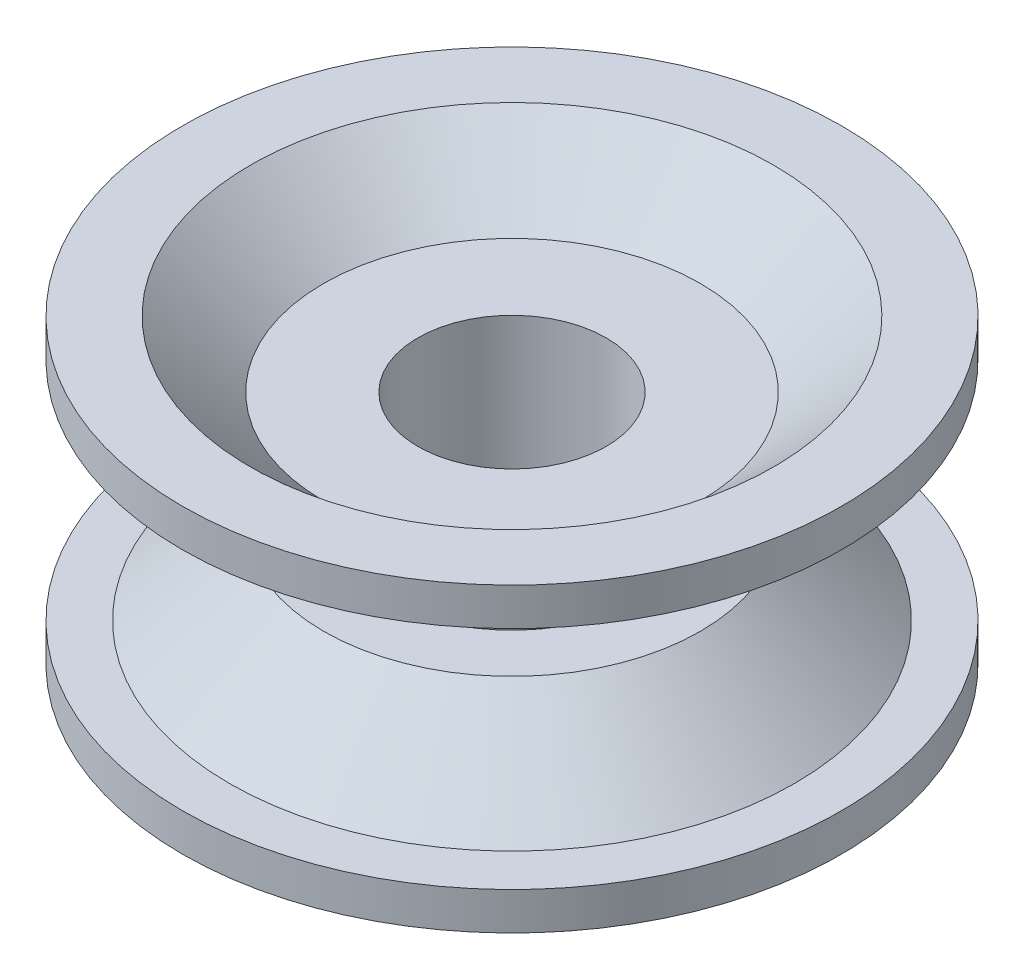
ISO-10303-21;
HEADER;
FILE_DESCRIPTION(('STEP AP214'),'2;1');
FILE_NAME('part.step','',(''),(''),'','','');
FILE_SCHEMA(('AUTOMOTIVE_DESIGN { 1 0 10303 214 1 1 1 1 }'));
ENDSEC;
DATA;
#1=APPLICATION_CONTEXT('core data for automotive mechanical design processes');
#2=APPLICATION_PROTOCOL_DEFINITION('international standard','automotive_design',2000,#1);
#3=PRODUCT_CONTEXT('',#1,'mechanical');
#4=PRODUCT('Part','Part','',(#3));
#5=PRODUCT_RELATED_PRODUCT_CATEGORY('part','',(#4));
#6=PRODUCT_DEFINITION_FORMATION('','',#4);
#7=PRODUCT_DEFINITION_CONTEXT('part definition',#1,'design');
#8=PRODUCT_DEFINITION('design','',#6,#7);
#9=PRODUCT_DEFINITION_SHAPE('','',#8);
#10=(LENGTH_UNIT() NAMED_UNIT(*) SI_UNIT(.MILLI.,.METRE.));
#11=(NAMED_UNIT(*) PLANE_ANGLE_UNIT() SI_UNIT($,.RADIAN.));
#12=(NAMED_UNIT(*) SI_UNIT($,.STERADIAN.) SOLID_ANGLE_UNIT());
#13=UNCERTAINTY_MEASURE_WITH_UNIT(LENGTH_MEASURE(1.E-05),#10,'distance_accuracy_value','');
#14=(GEOMETRIC_REPRESENTATION_CONTEXT(3) GLOBAL_UNCERTAINTY_ASSIGNED_CONTEXT((#13)) GLOBAL_UNIT_ASSIGNED_CONTEXT((#10,
#11,#12)) REPRESENTATION_CONTEXT('',''));
#15=CARTESIAN_POINT('',(0.,0.,0.));
#16=DIRECTION('',(0.,0.,1.));
#17=DIRECTION('',(1.,0.,0.));
#18=AXIS2_PLACEMENT_3D('',#15,#16,#17);
#19=CARTESIAN_POINT('',(0.,0.,0.));
#20=DIRECTION('',(0.,-1.,0.));
#21=DIRECTION('',(0.,0.,-1.));
#22=AXIS2_PLACEMENT_3D('',#19,#20,#21);
#23=CYLINDRICAL_SURFACE('',#22,3.5);
#24=CARTESIAN_POINT('',(0.,-1.2,0.));
#25=DIRECTION('',(0.,-1.,0.));
#26=DIRECTION('',(0.,0.,-1.));
#27=AXIS2_PLACEMENT_3D('',#24,#25,#26);
#28=CIRCLE('',#27,3.5);
#29=CARTESIAN_POINT('',(0.,-1.2,-3.5));
#30=VERTEX_POINT('',#29);
#31=EDGE_CURVE('E10',#30,#30,#28,.T.);
#32=ORIENTED_EDGE('',*,*,#31,.T.);
#33=EDGE_LOOP('',(#32));
#34=FACE_BOUND('',#33,.T.);
#35=CARTESIAN_POINT('',(0.,-1.6,0.));
#36=DIRECTION('',(0.,-1.,0.));
#37=DIRECTION('',(0.,0.,-1.));
#38=AXIS2_PLACEMENT_3D('',#35,#36,#37);
#39=CIRCLE('',#38,3.5);
#40=CARTESIAN_POINT('',(0.,-1.6,-3.5));
#41=VERTEX_POINT('',#40);
#42=EDGE_CURVE('E86',#41,#41,#39,.T.);
#43=ORIENTED_EDGE('',*,*,#42,.F.);
#44=EDGE_LOOP('',(#43));
#45=FACE_BOUND('',#44,.T.);
#46=ADVANCED_FACE('F28',(#34,#45),#23,.T.);
#47=CARTESIAN_POINT('',(3.5,-1.2,0.));
#48=DIRECTION('',(0.,1.,0.));
#49=DIRECTION('',(0.,0.,1.));
#50=AXIS2_PLACEMENT_3D('',#47,#48,#49);
#51=PLANE('',#50);
#52=CARTESIAN_POINT('',(0.,-1.2,0.));
#53=DIRECTION('',(0.,-1.,0.));
#54=DIRECTION('',(0.,0.,-1.));
#55=AXIS2_PLACEMENT_3D('',#52,#53,#54);
#56=CIRCLE('',#55,3.);
#57=CARTESIAN_POINT('',(0.,-1.2,-3.));
#58=VERTEX_POINT('',#57);
#59=EDGE_CURVE('E34',#58,#58,#56,.T.);
#60=ORIENTED_EDGE('',*,*,#59,.T.);
#61=EDGE_LOOP('',(#60));
#62=FACE_BOUND('',#61,.T.);
#63=ORIENTED_EDGE('',*,*,#31,.F.);
#64=EDGE_LOOP('',(#63));
#65=FACE_BOUND('',#64,.T.);
#66=ADVANCED_FACE('F94',(#62,#65),#51,.T.);
#67=CARTESIAN_POINT('',(0.,-1.2,0.));
#68=DIRECTION('',(0.,-1.,0.));
#69=DIRECTION('',(0.,0.,-1.));
#70=AXIS2_PLACEMENT_3D('',#67,#68,#69);
#71=CONICAL_SURFACE('',#70,3.,0.83798122500839);
#72=CARTESIAN_POINT('',(0.,-0.3,0.));
#73=DIRECTION('',(0.,-1.,0.));
#74=DIRECTION('',(0.,0.,-1.));
#75=AXIS2_PLACEMENT_3D('',#72,#73,#74);
#76=CIRCLE('',#75,2.);
#77=CARTESIAN_POINT('',(0.,-0.3,-2.));
#78=VERTEX_POINT('',#77);
#79=EDGE_CURVE('E38',#78,#78,#76,.T.);
#80=ORIENTED_EDGE('',*,*,#79,.T.);
#81=EDGE_LOOP('',(#80));
#82=FACE_BOUND('',#81,.T.);
#83=ORIENTED_EDGE('',*,*,#59,.F.);
#84=EDGE_LOOP('',(#83));
#85=FACE_BOUND('',#84,.T.);
#86=ADVANCED_FACE('F98',(#82,#85),#71,.T.);
#87=CARTESIAN_POINT('',(2.,-0.3,0.));
#88=DIRECTION('',(0.,1.,0.));
#89=DIRECTION('',(0.,0.,1.));
#90=AXIS2_PLACEMENT_3D('',#87,#88,#89);
#91=PLANE('',#90);
#92=CARTESIAN_POINT('',(0.,-0.3,0.));
#93=DIRECTION('',(0.,-1.,0.));
#94=DIRECTION('',(0.,0.,-1.));
#95=AXIS2_PLACEMENT_3D('',#92,#93,#94);
#96=CIRCLE('',#95,1.4);
#97=CARTESIAN_POINT('',(0.,-0.3,-1.4));
#98=VERTEX_POINT('',#97);
#99=EDGE_CURVE('E42',#98,#98,#96,.T.);
#100=ORIENTED_EDGE('',*,*,#99,.T.);
#101=EDGE_LOOP('',(#100));
#102=FACE_BOUND('',#101,.T.);
#103=ORIENTED_EDGE('',*,*,#79,.F.);
#104=EDGE_LOOP('',(#103));
#105=FACE_BOUND('',#104,.T.);
#106=ADVANCED_FACE('F102',(#102,#105),#91,.T.);
#107=CARTESIAN_POINT('',(0.,0.,0.));
#108=DIRECTION('',(0.,-1.,0.));
#109=DIRECTION('',(0.,0.,-1.));
#110=AXIS2_PLACEMENT_3D('',#107,#108,#109);
#111=CYLINDRICAL_SURFACE('',#110,1.4);
#112=CARTESIAN_POINT('',(0.,0.3,0.));
#113=DIRECTION('',(0.,-1.,0.));
#114=DIRECTION('',(0.,0.,-1.));
#115=AXIS2_PLACEMENT_3D('',#112,#113,#114);
#116=CIRCLE('',#115,1.4);
#117=CARTESIAN_POINT('',(0.,0.3,-1.4));
#118=VERTEX_POINT('',#117);
#119=EDGE_CURVE('E47',#118,#118,#116,.T.);
#120=ORIENTED_EDGE('',*,*,#119,.T.);
#121=EDGE_LOOP('',(#120));
#122=FACE_BOUND('',#121,.T.);
#123=ORIENTED_EDGE('',*,*,#99,.F.);
#124=EDGE_LOOP('',(#123));
#125=FACE_BOUND('',#124,.T.);
#126=ADVANCED_FACE('F109',(#122,#125),#111,.T.);
#127=CARTESIAN_POINT('',(1.4,0.3,0.));
#128=DIRECTION('',(0.,-1.,0.));
#129=DIRECTION('',(0.,0.,-1.));
#130=AXIS2_PLACEMENT_3D('',#127,#128,#129);
#131=PLANE('',#130);
#132=CARTESIAN_POINT('',(0.,0.3,0.));
#133=DIRECTION('',(0.,-1.,0.));
#134=DIRECTION('',(0.,0.,-1.));
#135=AXIS2_PLACEMENT_3D('',#132,#133,#134);
#136=CIRCLE('',#135,2.);
#137=CARTESIAN_POINT('',(0.,0.3,-2.));
#138=VERTEX_POINT('',#137);
#139=EDGE_CURVE('E50',#138,#138,#136,.T.);
#140=ORIENTED_EDGE('',*,*,#139,.T.);
#141=EDGE_LOOP('',(#140));
#142=FACE_BOUND('',#141,.T.);
#143=ORIENTED_EDGE('',*,*,#119,.F.);
#144=EDGE_LOOP('',(#143));
#145=FACE_BOUND('',#144,.T.);
#146=ADVANCED_FACE('F113',(#142,#145),#131,.T.);
#147=CARTESIAN_POINT('',(0.,0.3,0.));
#148=DIRECTION('',(0.,1.,0.));
#149=DIRECTION('',(0.,0.,1.));
#150=AXIS2_PLACEMENT_3D('',#147,#148,#149);
#151=CONICAL_SURFACE('',#150,2.,0.83798122500839);
#152=CARTESIAN_POINT('',(0.,1.2,0.));
#153=DIRECTION('',(0.,-1.,0.));
#154=DIRECTION('',(0.,0.,-1.));
#155=AXIS2_PLACEMENT_3D('',#152,#153,#154);
#156=CIRCLE('',#155,3.);
#157=CARTESIAN_POINT('',(0.,1.2,-3.));
#158=VERTEX_POINT('',#157);
#159=EDGE_CURVE('E53',#158,#158,#156,.T.);
#160=ORIENTED_EDGE('',*,*,#159,.T.);
#161=EDGE_LOOP('',(#160));
#162=FACE_BOUND('',#161,.T.);
#163=ORIENTED_EDGE('',*,*,#139,.F.);
#164=EDGE_LOOP('',(#163));
#165=FACE_BOUND('',#164,.T.);
#166=ADVANCED_FACE('F117',(#162,#165),#151,.T.);
#167=CARTESIAN_POINT('',(3.,1.2,0.));
#168=DIRECTION('',(0.,-1.,0.));
#169=DIRECTION('',(0.,0.,-1.));
#170=AXIS2_PLACEMENT_3D('',#167,#168,#169);
#171=PLANE('',#170);
#172=CARTESIAN_POINT('',(0.,1.2,0.));
#173=DIRECTION('',(0.,-1.,0.));
#174=DIRECTION('',(0.,0.,-1.));
#175=AXIS2_PLACEMENT_3D('',#172,#173,#174);
#176=CIRCLE('',#175,3.5);
#177=CARTESIAN_POINT('',(0.,1.2,-3.5));
#178=VERTEX_POINT('',#177);
#179=EDGE_CURVE('E56',#178,#178,#176,.T.);
#180=ORIENTED_EDGE('',*,*,#179,.T.);
#181=EDGE_LOOP('',(#180));
#182=FACE_BOUND('',#181,.T.);
#183=ORIENTED_EDGE('',*,*,#159,.F.);
#184=EDGE_LOOP('',(#183));
#185=FACE_BOUND('',#184,.T.);
#186=ADVANCED_FACE('F121',(#182,#185),#171,.T.);
#187=CARTESIAN_POINT('',(0.,0.,0.));
#188=DIRECTION('',(0.,-1.,0.));
#189=DIRECTION('',(0.,0.,-1.));
#190=AXIS2_PLACEMENT_3D('',#187,#188,#189);
#191=CYLINDRICAL_SURFACE('',#190,3.5);
#192=CARTESIAN_POINT('',(0.,1.6,0.));
#193=DIRECTION('',(0.,-1.,0.));
#194=DIRECTION('',(0.,0.,-1.));
#195=AXIS2_PLACEMENT_3D('',#192,#193,#194);
#196=CIRCLE('',#195,3.5);
#197=CARTESIAN_POINT('',(0.,1.6,-3.5));
#198=VERTEX_POINT('',#197);
#199=EDGE_CURVE('E59',#198,#198,#196,.T.);
#200=ORIENTED_EDGE('',*,*,#199,.T.);
#201=EDGE_LOOP('',(#200));
#202=FACE_BOUND('',#201,.T.);
#203=ORIENTED_EDGE('',*,*,#179,.F.);
#204=EDGE_LOOP('',(#203));
#205=FACE_BOUND('',#204,.T.);
#206=ADVANCED_FACE('F125',(#202,#205),#191,.T.);
#207=CARTESIAN_POINT('',(3.5,1.6,0.));
#208=DIRECTION('',(0.,1.,0.));
#209=DIRECTION('',(0.,0.,1.));
#210=AXIS2_PLACEMENT_3D('',#207,#208,#209);
#211=PLANE('',#210);
#212=CARTESIAN_POINT('',(0.,1.6,0.));
#213=DIRECTION('',(0.,-1.,0.));
#214=DIRECTION('',(0.,0.,-1.));
#215=AXIS2_PLACEMENT_3D('',#212,#213,#214);
#216=CIRCLE('',#215,2.77777777777778);
#217=CARTESIAN_POINT('',(0.,1.6,-2.77777777777778));
#218=VERTEX_POINT('',#217);
#219=EDGE_CURVE('E62',#218,#218,#216,.T.);
#220=ORIENTED_EDGE('',*,*,#219,.T.);
#221=EDGE_LOOP('',(#220));
#222=FACE_BOUND('',#221,.T.);
#223=ORIENTED_EDGE('',*,*,#199,.F.);
#224=EDGE_LOOP('',(#223));
#225=FACE_BOUND('',#224,.T.);
#226=ADVANCED_FACE('F129',(#222,#225),#211,.T.);
#227=CARTESIAN_POINT('',(0.,1.6,0.));
#228=DIRECTION('',(0.,1.,0.));
#229=DIRECTION('',(0.,0.,1.));
#230=AXIS2_PLACEMENT_3D('',#227,#228,#229);
#231=CONICAL_SURFACE('',#230,2.77777777777778,0.83798122500839);
#232=CARTESIAN_POINT('',(0.,0.9,0.));
#233=DIRECTION('',(0.,-1.,0.));
#234=DIRECTION('',(0.,0.,-1.));
#235=AXIS2_PLACEMENT_3D('',#232,#233,#234);
#236=CIRCLE('',#235,2.);
#237=CARTESIAN_POINT('',(0.,0.9,-2.));
#238=VERTEX_POINT('',#237);
#239=EDGE_CURVE('E65',#238,#238,#236,.T.);
#240=ORIENTED_EDGE('',*,*,#239,.T.);
#241=EDGE_LOOP('',(#240));
#242=FACE_BOUND('',#241,.T.);
#243=ORIENTED_EDGE('',*,*,#219,.F.);
#244=EDGE_LOOP('',(#243));
#245=FACE_BOUND('',#244,.T.);
#246=ADVANCED_FACE('F133',(#242,#245),#231,.F.);
#247=CARTESIAN_POINT('',(2.,0.9,0.));
#248=DIRECTION('',(0.,1.,0.));
#249=DIRECTION('',(0.,0.,1.));
#250=AXIS2_PLACEMENT_3D('',#247,#248,#249);
#251=PLANE('',#250);
#252=CARTESIAN_POINT('',(0.,0.9,0.));
#253=DIRECTION('',(0.,-1.,0.));
#254=DIRECTION('',(0.,0.,-1.));
#255=AXIS2_PLACEMENT_3D('',#252,#253,#254);
#256=CIRCLE('',#255,1.);
#257=CARTESIAN_POINT('',(0.,0.9,-1.));
#258=VERTEX_POINT('',#257);
#259=EDGE_CURVE('E68',#258,#258,#256,.T.);
#260=ORIENTED_EDGE('',*,*,#259,.T.);
#261=EDGE_LOOP('',(#260));
#262=FACE_BOUND('',#261,.T.);
#263=ORIENTED_EDGE('',*,*,#239,.F.);
#264=EDGE_LOOP('',(#263));
#265=FACE_BOUND('',#264,.T.);
#266=ADVANCED_FACE('F137',(#262,#265),#251,.T.);
#267=CARTESIAN_POINT('',(0.,0.,0.));
#268=DIRECTION('',(0.,-1.,0.));
#269=DIRECTION('',(0.,0.,-1.));
#270=AXIS2_PLACEMENT_3D('',#267,#268,#269);
#271=CYLINDRICAL_SURFACE('',#270,1.);
#272=CARTESIAN_POINT('',(0.,-2.4,0.));
#273=DIRECTION('',(0.,-1.,0.));
#274=DIRECTION('',(0.,0.,-1.));
#275=AXIS2_PLACEMENT_3D('',#272,#273,#274);
#276=CIRCLE('',#275,1.);
#277=CARTESIAN_POINT('',(0.,-2.4,-1.));
#278=VERTEX_POINT('',#277);
#279=EDGE_CURVE('E71',#278,#278,#276,.T.);
#280=ORIENTED_EDGE('',*,*,#279,.T.);
#281=EDGE_LOOP('',(#280));
#282=FACE_BOUND('',#281,.T.);
#283=ORIENTED_EDGE('',*,*,#259,.F.);
#284=EDGE_LOOP('',(#283));
#285=FACE_BOUND('',#284,.T.);
#286=ADVANCED_FACE('F141',(#282,#285),#271,.F.);
#287=CARTESIAN_POINT('',(1.,-2.4,0.));
#288=DIRECTION('',(0.,-1.,0.));
#289=DIRECTION('',(0.,0.,-1.));
#290=AXIS2_PLACEMENT_3D('',#287,#288,#289);
#291=PLANE('',#290);
#292=CARTESIAN_POINT('',(0.,-2.4,0.));
#293=DIRECTION('',(0.,-1.,0.));
#294=DIRECTION('',(0.,0.,-1.));
#295=AXIS2_PLACEMENT_3D('',#292,#293,#294);
#296=CIRCLE('',#295,1.4);
#297=CARTESIAN_POINT('',(0.,-2.4,-1.4));
#298=VERTEX_POINT('',#297);
#299=EDGE_CURVE('E74',#298,#298,#296,.T.);
#300=ORIENTED_EDGE('',*,*,#299,.T.);
#301=EDGE_LOOP('',(#300));
#302=FACE_BOUND('',#301,.T.);
#303=ORIENTED_EDGE('',*,*,#279,.F.);
#304=EDGE_LOOP('',(#303));
#305=FACE_BOUND('',#304,.T.);
#306=ADVANCED_FACE('F145',(#302,#305),#291,.T.);
#307=CARTESIAN_POINT('',(0.,0.,0.));
#308=DIRECTION('',(0.,-1.,0.));
#309=DIRECTION('',(0.,0.,-1.));
#310=AXIS2_PLACEMENT_3D('',#307,#308,#309);
#311=CYLINDRICAL_SURFACE('',#310,1.4);
#312=CARTESIAN_POINT('',(0.,-0.9,0.));
#313=DIRECTION('',(0.,-1.,0.));
#314=DIRECTION('',(0.,0.,-1.));
#315=AXIS2_PLACEMENT_3D('',#312,#313,#314);
#316=CIRCLE('',#315,1.4);
#317=CARTESIAN_POINT('',(0.,-0.9,-1.4));
#318=VERTEX_POINT('',#317);
#319=EDGE_CURVE('E77',#318,#318,#316,.T.);
#320=ORIENTED_EDGE('',*,*,#319,.T.);
#321=EDGE_LOOP('',(#320));
#322=FACE_BOUND('',#321,.T.);
#323=ORIENTED_EDGE('',*,*,#299,.F.);
#324=EDGE_LOOP('',(#323));
#325=FACE_BOUND('',#324,.T.);
#326=ADVANCED_FACE('F149',(#322,#325),#311,.T.);
#327=CARTESIAN_POINT('',(1.4,-0.9,0.));
#328=DIRECTION('',(0.,-1.,0.));
#329=DIRECTION('',(0.,0.,-1.));
#330=AXIS2_PLACEMENT_3D('',#327,#328,#329);
#331=PLANE('',#330);
#332=CARTESIAN_POINT('',(0.,-0.9,0.));
#333=DIRECTION('',(0.,-1.,0.));
#334=DIRECTION('',(0.,0.,-1.));
#335=AXIS2_PLACEMENT_3D('',#332,#333,#334);
#336=CIRCLE('',#335,2.);
#337=CARTESIAN_POINT('',(0.,-0.9,-2.));
#338=VERTEX_POINT('',#337);
#339=EDGE_CURVE('E80',#338,#338,#336,.T.);
#340=ORIENTED_EDGE('',*,*,#339,.T.);
#341=EDGE_LOOP('',(#340));
#342=FACE_BOUND('',#341,.T.);
#343=ORIENTED_EDGE('',*,*,#319,.F.);
#344=EDGE_LOOP('',(#343));
#345=FACE_BOUND('',#344,.T.);
#346=ADVANCED_FACE('F153',(#342,#345),#331,.T.);
#347=CARTESIAN_POINT('',(0.,-0.9,0.));
#348=DIRECTION('',(0.,-1.,0.));
#349=DIRECTION('',(0.,0.,-1.));
#350=AXIS2_PLACEMENT_3D('',#347,#348,#349);
#351=CONICAL_SURFACE('',#350,2.,0.83798122500839);
#352=CARTESIAN_POINT('',(0.,-1.6,0.));
#353=DIRECTION('',(0.,-1.,0.));
#354=DIRECTION('',(0.,0.,-1.));
#355=AXIS2_PLACEMENT_3D('',#352,#353,#354);
#356=CIRCLE('',#355,2.77777777777778);
#357=CARTESIAN_POINT('',(0.,-1.6,-2.77777777777778));
#358=VERTEX_POINT('',#357);
#359=EDGE_CURVE('E83',#358,#358,#356,.T.);
#360=ORIENTED_EDGE('',*,*,#359,.T.);
#361=EDGE_LOOP('',(#360));
#362=FACE_BOUND('',#361,.T.);
#363=ORIENTED_EDGE('',*,*,#339,.F.);
#364=EDGE_LOOP('',(#363));
#365=FACE_BOUND('',#364,.T.);
#366=ADVANCED_FACE('F157',(#362,#365),#351,.F.);
#367=CARTESIAN_POINT('',(2.77777777777778,-1.6,0.));
#368=DIRECTION('',(0.,-1.,0.));
#369=DIRECTION('',(0.,0.,-1.));
#370=AXIS2_PLACEMENT_3D('',#367,#368,#369);
#371=PLANE('',#370);
#372=ORIENTED_EDGE('',*,*,#42,.T.);
#373=EDGE_LOOP('',(#372));
#374=FACE_BOUND('',#373,.T.);
#375=ORIENTED_EDGE('',*,*,#359,.F.);
#376=EDGE_LOOP('',(#375));
#377=FACE_BOUND('',#376,.T.);
#378=ADVANCED_FACE('F90',(#374,#377),#371,.T.);
#379=CLOSED_SHELL('',(#46,#66,#86,#106,#126,#146,#166,#186,#206,#226,#246,#266,#286,#306,#326,
#346,#366,#378));
#380=MANIFOLD_SOLID_BREP('B2',#379);
#381=ADVANCED_BREP_SHAPE_REPRESENTATION('',(#18,#380),#14);
#382=SHAPE_DEFINITION_REPRESENTATION(#9,#381);
ENDSEC;
END-ISO-10303-21;
